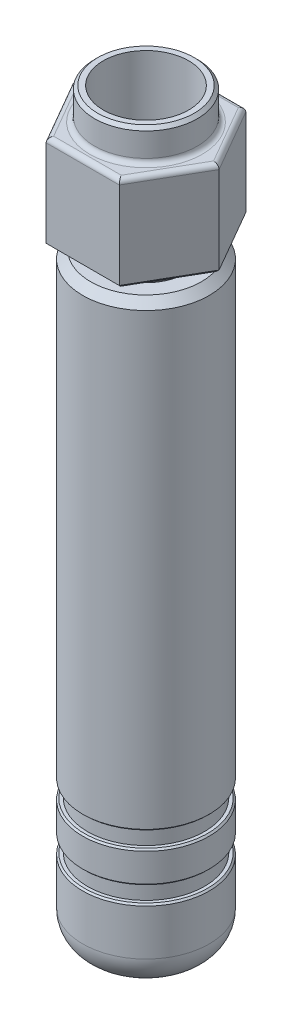
ISO-10303-21;
HEADER;
FILE_DESCRIPTION(('STEP AP214'),'2;1');
FILE_NAME('part.step','',(''),(''),'','','');
FILE_SCHEMA(('AUTOMOTIVE_DESIGN { 1 0 10303 214 1 1 1 1 }'));
ENDSEC;
DATA;
#1=APPLICATION_CONTEXT('core data for automotive mechanical design processes');
#2=APPLICATION_PROTOCOL_DEFINITION('international standard','automotive_design',2000,#1);
#3=PRODUCT_CONTEXT('',#1,'mechanical');
#4=PRODUCT('Part','Part','',(#3));
#5=PRODUCT_RELATED_PRODUCT_CATEGORY('part','',(#4));
#6=PRODUCT_DEFINITION_FORMATION('','',#4);
#7=PRODUCT_DEFINITION_CONTEXT('part definition',#1,'design');
#8=PRODUCT_DEFINITION('design','',#6,#7);
#9=PRODUCT_DEFINITION_SHAPE('','',#8);
#10=(LENGTH_UNIT() NAMED_UNIT(*) SI_UNIT(.MILLI.,.METRE.));
#11=(NAMED_UNIT(*) PLANE_ANGLE_UNIT() SI_UNIT($,.RADIAN.));
#12=(NAMED_UNIT(*) SI_UNIT($,.STERADIAN.) SOLID_ANGLE_UNIT());
#13=UNCERTAINTY_MEASURE_WITH_UNIT(LENGTH_MEASURE(1.E-05),#10,'distance_accuracy_value','');
#14=(GEOMETRIC_REPRESENTATION_CONTEXT(3) GLOBAL_UNCERTAINTY_ASSIGNED_CONTEXT((#13)) GLOBAL_UNIT_ASSIGNED_CONTEXT((#10,
#11,#12)) REPRESENTATION_CONTEXT('',''));
#15=CARTESIAN_POINT('',(0.,0.,0.));
#16=DIRECTION('',(0.,0.,1.));
#17=DIRECTION('',(1.,0.,0.));
#18=AXIS2_PLACEMENT_3D('',#15,#16,#17);
#19=CARTESIAN_POINT('',(0.,1.,0.));
#20=DIRECTION('',(0.,-1.,0.));
#21=DIRECTION('',(0.,0.,-1.));
#22=AXIS2_PLACEMENT_3D('',#19,#20,#21);
#23=CYLINDRICAL_SURFACE('',#22,2.85);
#24=CARTESIAN_POINT('',(0.,0.300000000000002,0.));
#25=DIRECTION('',(0.,1.,0.));
#26=DIRECTION('',(0.,0.,1.));
#27=AXIS2_PLACEMENT_3D('',#24,#25,#26);
#28=CIRCLE('',#27,2.85);
#29=CARTESIAN_POINT('',(0.,0.300000000000002,2.85));
#30=VERTEX_POINT('',#29);
#31=EDGE_CURVE('E255',#30,#30,#28,.T.);
#32=ORIENTED_EDGE('',*,*,#31,.T.);
#33=EDGE_LOOP('',(#32));
#34=FACE_BOUND('',#33,.T.);
#35=CARTESIAN_POINT('',(0.,0.800000000000002,0.));
#36=DIRECTION('',(0.,1.,0.));
#37=DIRECTION('',(0.,0.,1.));
#38=AXIS2_PLACEMENT_3D('',#35,#36,#37);
#39=CIRCLE('',#38,2.85);
#40=CARTESIAN_POINT('',(0.,0.800000000000002,2.85));
#41=VERTEX_POINT('',#40);
#42=EDGE_CURVE('E188',#41,#41,#39,.F.);
#43=ORIENTED_EDGE('',*,*,#42,.T.);
#44=EDGE_LOOP('',(#43));
#45=FACE_BOUND('',#44,.T.);
#46=ADVANCED_FACE('F39',(#34,#45),#23,.T.);
#47=CARTESIAN_POINT('',(2.3094010767585,7.,4.));
#48=DIRECTION('',(-0.866025403784439,0.,-0.5));
#49=DIRECTION('',(-0.5,0.,0.866025403784439));
#50=AXIS2_PLACEMENT_3D('',#47,#48,#49);
#51=PLANE('',#50);
#52=DIRECTION('',(0.,-1.,0.));
#53=VECTOR('',#52,1.);
#54=CARTESIAN_POINT('',(4.618802153517,7.,0.));
#55=LINE('',#54,#53);
#56=CARTESIAN_POINT('',(4.618802153517,6.7,0.));
#57=VERTEX_POINT('',#56);
#58=CARTESIAN_POINT('',(4.618802153517,1.2,0.));
#59=VERTEX_POINT('',#58);
#60=EDGE_CURVE('E136',#57,#59,#55,.T.);
#61=ORIENTED_EDGE('',*,*,#60,.F.);
#62=DIRECTION('',(0.5,0.,-0.866025403784439));
#63=VECTOR('',#62,1.);
#64=CARTESIAN_POINT('',(2.3094010767585,6.7,4.));
#65=LINE('',#64,#63);
#66=CARTESIAN_POINT('',(2.3094010767585,6.7,4.));
#67=VERTEX_POINT('',#66);
#68=EDGE_CURVE('E228',#57,#67,#65,.F.);
#69=ORIENTED_EDGE('',*,*,#68,.T.);
#70=DIRECTION('',(0.,-1.,0.));
#71=VECTOR('',#70,1.);
#72=CARTESIAN_POINT('',(2.3094010767585,7.,4.));
#73=LINE('',#72,#71);
#74=CARTESIAN_POINT('',(2.3094010767585,1.2,4.));
#75=VERTEX_POINT('',#74);
#76=EDGE_CURVE('E203',#67,#75,#73,.T.);
#77=ORIENTED_EDGE('',*,*,#76,.T.);
#78=DIRECTION('',(0.5,0.,-0.866025403784439));
#79=VECTOR('',#78,1.);
#80=CARTESIAN_POINT('',(2.3094010767585,1.2,4.));
#81=LINE('',#80,#79);
#82=EDGE_CURVE('E186',#75,#59,#81,.T.);
#83=ORIENTED_EDGE('',*,*,#82,.T.);
#84=EDGE_LOOP('',(#61,#69,#77,#83));
#85=FACE_BOUND('',#84,.T.);
#86=ADVANCED_FACE('F306',(#85),#51,.F.);
#87=CARTESIAN_POINT('',(4.618802153517,7.,0.));
#88=DIRECTION('',(-0.866025403784439,0.,0.5));
#89=DIRECTION('',(0.5,0.,0.866025403784439));
#90=AXIS2_PLACEMENT_3D('',#87,#88,#89);
#91=PLANE('',#90);
#92=DIRECTION('',(0.,-1.,0.));
#93=VECTOR('',#92,1.);
#94=CARTESIAN_POINT('',(2.3094010767585,7.,-4.));
#95=LINE('',#94,#93);
#96=CARTESIAN_POINT('',(2.3094010767585,6.7,-4.));
#97=VERTEX_POINT('',#96);
#98=CARTESIAN_POINT('',(2.3094010767585,1.2,-4.));
#99=VERTEX_POINT('',#98);
#100=EDGE_CURVE('E128',#97,#99,#95,.T.);
#101=ORIENTED_EDGE('',*,*,#100,.F.);
#102=DIRECTION('',(-0.5,0.,-0.866025403784439));
#103=VECTOR('',#102,1.);
#104=CARTESIAN_POINT('',(4.618802153517,6.7,0.));
#105=LINE('',#104,#103);
#106=EDGE_CURVE('E55',#97,#57,#105,.F.);
#107=ORIENTED_EDGE('',*,*,#106,.T.);
#108=ORIENTED_EDGE('',*,*,#60,.T.);
#109=DIRECTION('',(-0.5,0.,-0.866025403784439));
#110=VECTOR('',#109,1.);
#111=CARTESIAN_POINT('',(4.618802153517,1.2,0.));
#112=LINE('',#111,#110);
#113=EDGE_CURVE('E145',#59,#99,#112,.T.);
#114=ORIENTED_EDGE('',*,*,#113,.T.);
#115=EDGE_LOOP('',(#101,#107,#108,#114));
#116=FACE_BOUND('',#115,.T.);
#117=ADVANCED_FACE('F159',(#116),#91,.F.);
#118=CARTESIAN_POINT('',(2.3094010767585,7.,-4.));
#119=DIRECTION('',(0.,0.,1.));
#120=DIRECTION('',(1.,0.,0.));
#121=AXIS2_PLACEMENT_3D('',#118,#119,#120);
#122=PLANE('',#121);
#123=DIRECTION('',(0.,-1.,0.));
#124=VECTOR('',#123,1.);
#125=CARTESIAN_POINT('',(-2.3094010767585,7.,-4.));
#126=LINE('',#125,#124);
#127=CARTESIAN_POINT('',(-2.3094010767585,6.7,-4.));
#128=VERTEX_POINT('',#127);
#129=CARTESIAN_POINT('',(-2.3094010767585,1.2,-4.));
#130=VERTEX_POINT('',#129);
#131=EDGE_CURVE('E137',#128,#130,#126,.T.);
#132=ORIENTED_EDGE('',*,*,#131,.F.);
#133=DIRECTION('',(-1.,0.,0.));
#134=VECTOR('',#133,1.);
#135=CARTESIAN_POINT('',(2.3094010767585,6.7,-4.));
#136=LINE('',#135,#134);
#137=EDGE_CURVE('E63',#128,#97,#136,.F.);
#138=ORIENTED_EDGE('',*,*,#137,.T.);
#139=ORIENTED_EDGE('',*,*,#100,.T.);
#140=DIRECTION('',(-1.,0.,0.));
#141=VECTOR('',#140,1.);
#142=CARTESIAN_POINT('',(2.3094010767585,1.2,-4.));
#143=LINE('',#142,#141);
#144=EDGE_CURVE('E132',#99,#130,#143,.T.);
#145=ORIENTED_EDGE('',*,*,#144,.T.);
#146=EDGE_LOOP('',(#132,#138,#139,#145));
#147=FACE_BOUND('',#146,.T.);
#148=ADVANCED_FACE('F130',(#147),#122,.F.);
#149=CARTESIAN_POINT('',(-2.3094010767585,7.,-4.));
#150=DIRECTION('',(0.866025403784439,0.,0.5));
#151=DIRECTION('',(0.5,0.,-0.866025403784439));
#152=AXIS2_PLACEMENT_3D('',#149,#150,#151);
#153=PLANE('',#152);
#154=DIRECTION('',(0.,-1.,0.));
#155=VECTOR('',#154,1.);
#156=CARTESIAN_POINT('',(-4.61880215351701,7.,0.));
#157=LINE('',#156,#155);
#158=CARTESIAN_POINT('',(-4.61880215351701,6.7,0.));
#159=VERTEX_POINT('',#158);
#160=CARTESIAN_POINT('',(-4.61880215351701,1.2,0.));
#161=VERTEX_POINT('',#160);
#162=EDGE_CURVE('E591',#159,#161,#157,.T.);
#163=ORIENTED_EDGE('',*,*,#162,.F.);
#164=DIRECTION('',(-0.5,0.,0.866025403784439));
#165=VECTOR('',#164,1.);
#166=CARTESIAN_POINT('',(-2.3094010767585,6.7,-4.));
#167=LINE('',#166,#165);
#168=EDGE_CURVE('E224',#159,#128,#167,.F.);
#169=ORIENTED_EDGE('',*,*,#168,.T.);
#170=ORIENTED_EDGE('',*,*,#131,.T.);
#171=DIRECTION('',(-0.5,0.,0.866025403784439));
#172=VECTOR('',#171,1.);
#173=CARTESIAN_POINT('',(-2.3094010767585,1.2,-4.));
#174=LINE('',#173,#172);
#175=EDGE_CURVE('E157',#130,#161,#174,.T.);
#176=ORIENTED_EDGE('',*,*,#175,.T.);
#177=EDGE_LOOP('',(#163,#169,#170,#176));
#178=FACE_BOUND('',#177,.T.);
#179=ADVANCED_FACE('F595',(#178),#153,.F.);
#180=CARTESIAN_POINT('',(-4.61880215351701,7.,0.));
#181=DIRECTION('',(0.866025403784439,0.,-0.5));
#182=DIRECTION('',(-0.5,0.,-0.866025403784439));
#183=AXIS2_PLACEMENT_3D('',#180,#181,#182);
#184=PLANE('',#183);
#185=DIRECTION('',(0.,-1.,0.));
#186=VECTOR('',#185,1.);
#187=CARTESIAN_POINT('',(-2.3094010767585,7.,4.));
#188=LINE('',#187,#186);
#189=CARTESIAN_POINT('',(-2.3094010767585,6.7,4.));
#190=VERTEX_POINT('',#189);
#191=CARTESIAN_POINT('',(-2.3094010767585,1.2,4.));
#192=VERTEX_POINT('',#191);
#193=EDGE_CURVE('E589',#190,#192,#188,.T.);
#194=ORIENTED_EDGE('',*,*,#193,.F.);
#195=DIRECTION('',(0.5,0.,0.866025403784439));
#196=VECTOR('',#195,1.);
#197=CARTESIAN_POINT('',(-4.61880215351701,6.7,0.));
#198=LINE('',#197,#196);
#199=EDGE_CURVE('E222',#190,#159,#198,.F.);
#200=ORIENTED_EDGE('',*,*,#199,.T.);
#201=ORIENTED_EDGE('',*,*,#162,.T.);
#202=DIRECTION('',(0.5,0.,0.866025403784439));
#203=VECTOR('',#202,1.);
#204=CARTESIAN_POINT('',(-4.61880215351701,1.2,0.));
#205=LINE('',#204,#203);
#206=EDGE_CURVE('E180',#161,#192,#205,.T.);
#207=ORIENTED_EDGE('',*,*,#206,.T.);
#208=EDGE_LOOP('',(#194,#200,#201,#207));
#209=FACE_BOUND('',#208,.T.);
#210=ADVANCED_FACE('F622',(#209),#184,.F.);
#211=CARTESIAN_POINT('',(-2.3094010767585,7.,4.));
#212=DIRECTION('',(0.,0.,-1.));
#213=DIRECTION('',(-1.,0.,0.));
#214=AXIS2_PLACEMENT_3D('',#211,#212,#213);
#215=PLANE('',#214);
#216=ORIENTED_EDGE('',*,*,#76,.F.);
#217=DIRECTION('',(1.,0.,0.));
#218=VECTOR('',#217,1.);
#219=CARTESIAN_POINT('',(-2.3094010767585,6.7,4.));
#220=LINE('',#219,#218);
#221=EDGE_CURVE('E219',#67,#190,#220,.F.);
#222=ORIENTED_EDGE('',*,*,#221,.T.);
#223=ORIENTED_EDGE('',*,*,#193,.T.);
#224=DIRECTION('',(1.,0.,0.));
#225=VECTOR('',#224,1.);
#226=CARTESIAN_POINT('',(-2.3094010767585,1.2,4.));
#227=LINE('',#226,#225);
#228=EDGE_CURVE('E183',#192,#75,#227,.T.);
#229=ORIENTED_EDGE('',*,*,#228,.T.);
#230=EDGE_LOOP('',(#216,#222,#223,#229));
#231=FACE_BOUND('',#230,.T.);
#232=ADVANCED_FACE('F615',(#231),#215,.F.);
#233=CARTESIAN_POINT('',(0.,7.,0.));
#234=DIRECTION('',(0.,1.,0.));
#235=DIRECTION('',(0.,0.,1.));
#236=AXIS2_PLACEMENT_3D('',#233,#234,#235);
#237=PLANE('',#236);
#238=DIRECTION('',(0.5,0.,0.866025403784439));
#239=VECTOR('',#238,1.);
#240=CARTESIAN_POINT('',(-2.04959345562317,7.,3.85));
#241=LINE('',#240,#239);
#242=CARTESIAN_POINT('',(-4.27239199200323,7.,0.));
#243=VERTEX_POINT('',#242);
#244=CARTESIAN_POINT('',(-2.13619599600161,7.,3.7));
#245=VERTEX_POINT('',#244);
#246=EDGE_CURVE('E214',#243,#245,#241,.T.);
#247=ORIENTED_EDGE('',*,*,#246,.T.);
#248=DIRECTION('',(1.,0.,0.));
#249=VECTOR('',#248,1.);
#250=CARTESIAN_POINT('',(2.3094010767585,7.,3.7));
#251=LINE('',#250,#249);
#252=CARTESIAN_POINT('',(2.13619599600162,7.,3.7));
#253=VERTEX_POINT('',#252);
#254=EDGE_CURVE('E216',#245,#253,#251,.T.);
#255=ORIENTED_EDGE('',*,*,#254,.T.);
#256=DIRECTION('',(0.5,0.,-0.866025403784439));
#257=VECTOR('',#256,1.);
#258=CARTESIAN_POINT('',(4.35899453238167,7.,-0.150000000000001));
#259=LINE('',#258,#257);
#260=CARTESIAN_POINT('',(4.27239199200323,7.,0.));
#261=VERTEX_POINT('',#260);
#262=EDGE_CURVE('E206',#253,#261,#259,.T.);
#263=ORIENTED_EDGE('',*,*,#262,.T.);
#264=DIRECTION('',(-0.5,0.,-0.866025403784439));
#265=VECTOR('',#264,1.);
#266=CARTESIAN_POINT('',(2.04959345562317,7.,-3.85));
#267=LINE('',#266,#265);
#268=CARTESIAN_POINT('',(2.13619599600161,7.,-3.7));
#269=VERTEX_POINT('',#268);
#270=EDGE_CURVE('E208',#261,#269,#267,.T.);
#271=ORIENTED_EDGE('',*,*,#270,.T.);
#272=DIRECTION('',(-1.,0.,0.));
#273=VECTOR('',#272,1.);
#274=CARTESIAN_POINT('',(-2.3094010767585,7.,-3.7));
#275=LINE('',#274,#273);
#276=CARTESIAN_POINT('',(-2.13619599600162,7.,-3.7));
#277=VERTEX_POINT('',#276);
#278=EDGE_CURVE('E210',#269,#277,#275,.T.);
#279=ORIENTED_EDGE('',*,*,#278,.T.);
#280=DIRECTION('',(-0.5,0.,0.866025403784439));
#281=VECTOR('',#280,1.);
#282=CARTESIAN_POINT('',(-4.35899453238167,7.,0.150000000000001));
#283=LINE('',#282,#281);
#284=EDGE_CURVE('E212',#277,#243,#283,.T.);
#285=ORIENTED_EDGE('',*,*,#284,.T.);
#286=EDGE_LOOP('',(#247,#255,#263,#271,#279,#285));
#287=FACE_BOUND('',#286,.T.);
#288=CARTESIAN_POINT('',(0.,7.,0.));
#289=DIRECTION('',(0.,1.,0.));
#290=DIRECTION('',(0.,0.,1.));
#291=AXIS2_PLACEMENT_3D('',#288,#289,#290);
#292=CIRCLE('',#291,3.55);
#293=CARTESIAN_POINT('',(0.,7.,3.55));
#294=VERTEX_POINT('',#293);
#295=EDGE_CURVE('E190',#294,#294,#292,.F.);
#296=ORIENTED_EDGE('',*,*,#295,.T.);
#297=EDGE_LOOP('',(#296));
#298=FACE_BOUND('',#297,.T.);
#299=ADVANCED_FACE('F604',(#287,#298),#237,.T.);
#300=CARTESIAN_POINT('',(0.,1.,0.));
#301=DIRECTION('',(0.,1.,0.));
#302=DIRECTION('',(0.,0.,1.));
#303=AXIS2_PLACEMENT_3D('',#300,#301,#302);
#304=PLANE('',#303);
#305=DIRECTION('',(1.,0.,0.));
#306=VECTOR('',#305,1.);
#307=CARTESIAN_POINT('',(0.,1.,-3.8));
#308=LINE('',#307,#306);
#309=CARTESIAN_POINT('',(-2.19393102292058,1.,-3.8));
#310=VERTEX_POINT('',#309);
#311=CARTESIAN_POINT('',(2.19393102292058,1.,-3.8));
#312=VERTEX_POINT('',#311);
#313=EDGE_CURVE('E175',#310,#312,#308,.T.);
#314=ORIENTED_EDGE('',*,*,#313,.T.);
#315=DIRECTION('',(0.5,0.,0.866025403784439));
#316=VECTOR('',#315,1.);
#317=CARTESIAN_POINT('',(3.29089653438086,1.,-1.9));
#318=LINE('',#317,#316);
#319=CARTESIAN_POINT('',(4.38786204584115,1.,0.));
#320=VERTEX_POINT('',#319);
#321=EDGE_CURVE('E147',#312,#320,#318,.T.);
#322=ORIENTED_EDGE('',*,*,#321,.T.);
#323=DIRECTION('',(-0.5,0.,0.866025403784439));
#324=VECTOR('',#323,1.);
#325=CARTESIAN_POINT('',(3.29089653438086,1.,1.9));
#326=LINE('',#325,#324);
#327=CARTESIAN_POINT('',(2.19393102292058,1.,3.8));
#328=VERTEX_POINT('',#327);
#329=EDGE_CURVE('E164',#320,#328,#326,.T.);
#330=ORIENTED_EDGE('',*,*,#329,.T.);
#331=DIRECTION('',(-1.,0.,0.));
#332=VECTOR('',#331,1.);
#333=CARTESIAN_POINT('',(0.,1.,3.8));
#334=LINE('',#333,#332);
#335=CARTESIAN_POINT('',(-2.19393102292058,1.,3.8));
#336=VERTEX_POINT('',#335);
#337=EDGE_CURVE('E169',#328,#336,#334,.T.);
#338=ORIENTED_EDGE('',*,*,#337,.T.);
#339=DIRECTION('',(-0.5,0.,-0.866025403784439));
#340=VECTOR('',#339,1.);
#341=CARTESIAN_POINT('',(-3.29089653438086,1.,1.9));
#342=LINE('',#341,#340);
#343=CARTESIAN_POINT('',(-4.38786204584115,1.,0.));
#344=VERTEX_POINT('',#343);
#345=EDGE_CURVE('E171',#336,#344,#342,.T.);
#346=ORIENTED_EDGE('',*,*,#345,.T.);
#347=DIRECTION('',(0.5,0.,-0.866025403784439));
#348=VECTOR('',#347,1.);
#349=CARTESIAN_POINT('',(-3.29089653438087,1.,-1.9));
#350=LINE('',#349,#348);
#351=EDGE_CURVE('E173',#344,#310,#350,.T.);
#352=ORIENTED_EDGE('',*,*,#351,.T.);
#353=EDGE_LOOP('',(#314,#322,#330,#338,#346,#352));
#354=FACE_BOUND('',#353,.T.);
#355=CARTESIAN_POINT('',(0.,1.,0.));
#356=DIRECTION('',(0.,1.,0.));
#357=DIRECTION('',(0.,0.,1.));
#358=AXIS2_PLACEMENT_3D('',#355,#356,#357);
#359=CIRCLE('',#358,3.05);
#360=CARTESIAN_POINT('',(0.,1.,3.05));
#361=VERTEX_POINT('',#360);
#362=EDGE_CURVE('E161',#361,#361,#359,.T.);
#363=ORIENTED_EDGE('',*,*,#362,.T.);
#364=EDGE_LOOP('',(#363));
#365=FACE_BOUND('',#364,.T.);
#366=ADVANCED_FACE('F631',(#354,#365),#304,.F.);
#367=CARTESIAN_POINT('',(0.,9.,0.));
#368=DIRECTION('',(0.,-1.,0.));
#369=DIRECTION('',(0.,0.,-1.));
#370=AXIS2_PLACEMENT_3D('',#367,#368,#369);
#371=CYLINDRICAL_SURFACE('',#370,3.25);
#372=CARTESIAN_POINT('',(0.,8.8,0.));
#373=DIRECTION('',(0.,1.,0.));
#374=DIRECTION('',(0.,0.,1.));
#375=AXIS2_PLACEMENT_3D('',#372,#373,#374);
#376=CIRCLE('',#375,3.25);
#377=CARTESIAN_POINT('',(0.,8.8,3.25));
#378=VERTEX_POINT('',#377);
#379=EDGE_CURVE('E252',#378,#378,#376,.F.);
#380=ORIENTED_EDGE('',*,*,#379,.T.);
#381=EDGE_LOOP('',(#380));
#382=FACE_BOUND('',#381,.T.);
#383=CARTESIAN_POINT('',(0.,7.3,0.));
#384=DIRECTION('',(0.,1.,0.));
#385=DIRECTION('',(0.,0.,1.));
#386=AXIS2_PLACEMENT_3D('',#383,#384,#385);
#387=CIRCLE('',#386,3.25);
#388=CARTESIAN_POINT('',(0.,7.3,3.25));
#389=VERTEX_POINT('',#388);
#390=EDGE_CURVE('E230',#389,#389,#387,.T.);
#391=ORIENTED_EDGE('',*,*,#390,.T.);
#392=EDGE_LOOP('',(#391));
#393=FACE_BOUND('',#392,.T.);
#394=ADVANCED_FACE('F635',(#382,#393),#371,.T.);
#395=CARTESIAN_POINT('',(0.,9.,0.));
#396=DIRECTION('',(0.,1.,0.));
#397=DIRECTION('',(0.,0.,1.));
#398=AXIS2_PLACEMENT_3D('',#395,#396,#397);
#399=PLANE('',#398);
#400=CARTESIAN_POINT('',(0.,9.,0.));
#401=DIRECTION('',(0.,1.,0.));
#402=DIRECTION('',(0.,0.,1.));
#403=AXIS2_PLACEMENT_3D('',#400,#401,#402);
#404=CIRCLE('',#403,2.7);
#405=CARTESIAN_POINT('',(0.,9.,2.7));
#406=VERTEX_POINT('',#405);
#407=EDGE_CURVE('E576',#406,#406,#404,.T.);
#408=ORIENTED_EDGE('',*,*,#407,.F.);
#409=EDGE_LOOP('',(#408));
#410=FACE_BOUND('',#409,.T.);
#411=CARTESIAN_POINT('',(0.,9.,0.));
#412=DIRECTION('',(0.,1.,0.));
#413=DIRECTION('',(0.,0.,1.));
#414=AXIS2_PLACEMENT_3D('',#411,#412,#413);
#415=CIRCLE('',#414,3.05);
#416=CARTESIAN_POINT('',(0.,9.,3.05));
#417=VERTEX_POINT('',#416);
#418=EDGE_CURVE('E233',#417,#417,#415,.T.);
#419=ORIENTED_EDGE('',*,*,#418,.T.);
#420=EDGE_LOOP('',(#419));
#421=FACE_BOUND('',#420,.T.);
#422=ADVANCED_FACE('F356',(#410,#421),#399,.T.);
#423=CARTESIAN_POINT('',(-4.61880215351701,1.2,0.));
#424=DIRECTION('',(0.612372435695794,0.707106781186549,-0.353553390593273));
#425=DIRECTION('',(0.5,0.,0.866025403784439));
#426=AXIS2_PLACEMENT_3D('',#423,#424,#425);
#427=PLANE('',#426);
#428=DIRECTION('',(0.755928946018455,-0.654653670707977,0.));
#429=VECTOR('',#428,1.);
#430=CARTESIAN_POINT('',(-4.61880215351701,1.2,0.));
#431=LINE('',#430,#429);
#432=EDGE_CURVE('E197',#344,#161,#431,.F.);
#433=ORIENTED_EDGE('',*,*,#432,.F.);
#434=ORIENTED_EDGE('',*,*,#345,.F.);
#435=DIRECTION('',(0.377964473009229,-0.654653670707977,-0.654653670707977));
#436=VECTOR('',#435,1.);
#437=CARTESIAN_POINT('',(-2.3094010767585,1.2,4.));
#438=LINE('',#437,#436);
#439=EDGE_CURVE('E200',#192,#336,#438,.T.);
#440=ORIENTED_EDGE('',*,*,#439,.F.);
#441=ORIENTED_EDGE('',*,*,#206,.F.);
#442=EDGE_LOOP('',(#433,#434,#440,#441));
#443=FACE_BOUND('',#442,.T.);
#444=ADVANCED_FACE('F350',(#443),#427,.F.);
#445=CARTESIAN_POINT('',(-2.3094010767585,1.2,4.));
#446=DIRECTION('',(0.,0.707106781186547,-0.707106781186547));
#447=DIRECTION('',(1.,0.,0.));
#448=AXIS2_PLACEMENT_3D('',#445,#446,#447);
#449=PLANE('',#448);
#450=ORIENTED_EDGE('',*,*,#439,.T.);
#451=ORIENTED_EDGE('',*,*,#337,.F.);
#452=DIRECTION('',(-0.37796447300923,-0.654653670707977,-0.654653670707977));
#453=VECTOR('',#452,1.);
#454=CARTESIAN_POINT('',(2.3094010767585,1.2,4.));
#455=LINE('',#454,#453);
#456=EDGE_CURVE('E194',#75,#328,#455,.T.);
#457=ORIENTED_EDGE('',*,*,#456,.F.);
#458=ORIENTED_EDGE('',*,*,#228,.F.);
#459=EDGE_LOOP('',(#450,#451,#457,#458));
#460=FACE_BOUND('',#459,.T.);
#461=ADVANCED_FACE('F343',(#460),#449,.F.);
#462=CARTESIAN_POINT('',(-2.3094010767585,1.2,-4.));
#463=DIRECTION('',(0.612372435695795,0.707106781186548,0.353553390593274));
#464=DIRECTION('',(-0.5,0.,0.866025403784439));
#465=AXIS2_PLACEMENT_3D('',#462,#463,#464);
#466=PLANE('',#465);
#467=ORIENTED_EDGE('',*,*,#432,.T.);
#468=ORIENTED_EDGE('',*,*,#175,.F.);
#469=DIRECTION('',(0.377964473009228,-0.654653670707977,0.654653670707977));
#470=VECTOR('',#469,1.);
#471=CARTESIAN_POINT('',(-2.3094010767585,1.2,-4.));
#472=LINE('',#471,#470);
#473=EDGE_CURVE('E156',#310,#130,#472,.F.);
#474=ORIENTED_EDGE('',*,*,#473,.F.);
#475=ORIENTED_EDGE('',*,*,#351,.F.);
#476=EDGE_LOOP('',(#467,#468,#474,#475));
#477=FACE_BOUND('',#476,.T.);
#478=ADVANCED_FACE('F336',(#477),#466,.F.);
#479=CARTESIAN_POINT('',(2.3094010767585,1.2,4.));
#480=DIRECTION('',(-0.612372435695794,0.707106781186549,-0.353553390593273));
#481=DIRECTION('',(0.5,0.,-0.866025403784439));
#482=AXIS2_PLACEMENT_3D('',#479,#480,#481);
#483=PLANE('',#482);
#484=ORIENTED_EDGE('',*,*,#456,.T.);
#485=ORIENTED_EDGE('',*,*,#329,.F.);
#486=DIRECTION('',(0.755928946018455,0.654653670707976,0.));
#487=VECTOR('',#486,1.);
#488=CARTESIAN_POINT('',(3.29914439536929,0.0571428571428654,0.));
#489=LINE('',#488,#487);
#490=EDGE_CURVE('E150',#59,#320,#489,.F.);
#491=ORIENTED_EDGE('',*,*,#490,.F.);
#492=ORIENTED_EDGE('',*,*,#82,.F.);
#493=EDGE_LOOP('',(#484,#485,#491,#492));
#494=FACE_BOUND('',#493,.T.);
#495=ADVANCED_FACE('F330',(#494),#483,.F.);
#496=CARTESIAN_POINT('',(2.3094010767585,1.2,-4.));
#497=DIRECTION('',(0.,0.707106781186547,0.707106781186547));
#498=DIRECTION('',(-1.,0.,0.));
#499=AXIS2_PLACEMENT_3D('',#496,#497,#498);
#500=PLANE('',#499);
#501=ORIENTED_EDGE('',*,*,#473,.T.);
#502=ORIENTED_EDGE('',*,*,#144,.F.);
#503=DIRECTION('',(-0.377964473009228,-0.654653670707977,0.654653670707977));
#504=VECTOR('',#503,1.);
#505=CARTESIAN_POINT('',(2.3094010767585,1.2,-4.));
#506=LINE('',#505,#504);
#507=EDGE_CURVE('E143',#312,#99,#506,.F.);
#508=ORIENTED_EDGE('',*,*,#507,.F.);
#509=ORIENTED_EDGE('',*,*,#313,.F.);
#510=EDGE_LOOP('',(#501,#502,#508,#509));
#511=FACE_BOUND('',#510,.T.);
#512=ADVANCED_FACE('F154',(#511),#500,.F.);
#513=CARTESIAN_POINT('',(4.618802153517,1.2,0.));
#514=DIRECTION('',(-0.612372435695794,0.707106781186548,0.353553390593274));
#515=DIRECTION('',(-0.5,0.,-0.866025403784439));
#516=AXIS2_PLACEMENT_3D('',#513,#514,#515);
#517=PLANE('',#516);
#518=ORIENTED_EDGE('',*,*,#490,.T.);
#519=ORIENTED_EDGE('',*,*,#321,.F.);
#520=ORIENTED_EDGE('',*,*,#507,.T.);
#521=ORIENTED_EDGE('',*,*,#113,.F.);
#522=EDGE_LOOP('',(#518,#519,#520,#521));
#523=FACE_BOUND('',#522,.T.);
#524=ADVANCED_FACE('F144',(#523),#517,.F.);
#525=CARTESIAN_POINT('',(0.,1.,0.));
#526=DIRECTION('',(0.,1.,0.));
#527=DIRECTION('',(0.,0.,1.));
#528=AXIS2_PLACEMENT_3D('',#525,#526,#527);
#529=CONICAL_SURFACE('',#528,3.05,0.785398163397451);
#530=ORIENTED_EDGE('',*,*,#42,.F.);
#531=EDGE_LOOP('',(#530));
#532=FACE_BOUND('',#531,.T.);
#533=ORIENTED_EDGE('',*,*,#362,.F.);
#534=EDGE_LOOP('',(#533));
#535=FACE_BOUND('',#534,.T.);
#536=ADVANCED_FACE('F324',(#532,#535),#529,.T.);
#537=CARTESIAN_POINT('',(0.,6.7,-3.7));
#538=DIRECTION('',(1.,0.,0.));
#539=DIRECTION('',(0.,0.,-1.));
#540=AXIS2_PLACEMENT_3D('',#537,#538,#539);
#541=CYLINDRICAL_SURFACE('',#540,0.3);
#542=CARTESIAN_POINT('',(2.13619599600161,6.7,-3.7));
#543=DIRECTION('',(0.866025403784439,0.,0.5));
#544=DIRECTION('',(-0.5,0.,0.866025403784439));
#545=AXIS2_PLACEMENT_3D('',#542,#543,#544);
#546=ELLIPSE('',#545,0.346410161513775,0.3);
#547=EDGE_CURVE('E245',#97,#269,#546,.T.);
#548=ORIENTED_EDGE('',*,*,#547,.F.);
#549=ORIENTED_EDGE('',*,*,#137,.F.);
#550=CARTESIAN_POINT('',(-2.13619599600161,6.7,-3.7));
#551=DIRECTION('',(0.866025403784439,0.,-0.5));
#552=DIRECTION('',(0.5,0.,0.866025403784439));
#553=AXIS2_PLACEMENT_3D('',#550,#551,#552);
#554=ELLIPSE('',#553,0.346410161513775,0.3);
#555=EDGE_CURVE('E151',#277,#128,#554,.F.);
#556=ORIENTED_EDGE('',*,*,#555,.F.);
#557=ORIENTED_EDGE('',*,*,#278,.F.);
#558=EDGE_LOOP('',(#548,#549,#556,#557));
#559=FACE_BOUND('',#558,.T.);
#560=ADVANCED_FACE('F363',(#559),#541,.T.);
#561=CARTESIAN_POINT('',(-3.20429399400242,6.7,-1.85));
#562=DIRECTION('',(0.5,0.,-0.866025403784439));
#563=DIRECTION('',(-0.866025403784439,0.,-0.5));
#564=AXIS2_PLACEMENT_3D('',#561,#562,#563);
#565=CYLINDRICAL_SURFACE('',#564,0.3);
#566=ORIENTED_EDGE('',*,*,#555,.T.);
#567=ORIENTED_EDGE('',*,*,#168,.F.);
#568=CARTESIAN_POINT('',(-4.27239199200323,6.7,0.));
#569=DIRECTION('',(0.,0.,-1.));
#570=DIRECTION('',(1.,0.,0.));
#571=AXIS2_PLACEMENT_3D('',#568,#569,#570);
#572=ELLIPSE('',#571,0.346410161513775,0.3);
#573=EDGE_CURVE('E242',#243,#159,#572,.F.);
#574=ORIENTED_EDGE('',*,*,#573,.F.);
#575=ORIENTED_EDGE('',*,*,#284,.F.);
#576=EDGE_LOOP('',(#566,#567,#574,#575));
#577=FACE_BOUND('',#576,.T.);
#578=ADVANCED_FACE('F381',(#577),#565,.T.);
#579=CARTESIAN_POINT('',(3.20429399400242,6.7,-1.85));
#580=DIRECTION('',(0.5,0.,0.866025403784439));
#581=DIRECTION('',(0.866025403784439,0.,-0.5));
#582=AXIS2_PLACEMENT_3D('',#579,#580,#581);
#583=CYLINDRICAL_SURFACE('',#582,0.3);
#584=ORIENTED_EDGE('',*,*,#547,.T.);
#585=ORIENTED_EDGE('',*,*,#270,.F.);
#586=CARTESIAN_POINT('',(4.27239199200323,6.7,0.));
#587=DIRECTION('',(0.,0.,1.));
#588=DIRECTION('',(-1.,0.,0.));
#589=AXIS2_PLACEMENT_3D('',#586,#587,#588);
#590=ELLIPSE('',#589,0.346410161513775,0.3);
#591=EDGE_CURVE('E239',#57,#261,#590,.T.);
#592=ORIENTED_EDGE('',*,*,#591,.F.);
#593=ORIENTED_EDGE('',*,*,#106,.F.);
#594=EDGE_LOOP('',(#584,#585,#592,#593));
#595=FACE_BOUND('',#594,.T.);
#596=ADVANCED_FACE('F377',(#595),#583,.T.);
#597=CARTESIAN_POINT('',(-3.20429399400242,6.7,1.85));
#598=DIRECTION('',(-0.5,0.,-0.866025403784439));
#599=DIRECTION('',(-0.866025403784439,0.,0.5));
#600=AXIS2_PLACEMENT_3D('',#597,#598,#599);
#601=CYLINDRICAL_SURFACE('',#600,0.3);
#602=ORIENTED_EDGE('',*,*,#573,.T.);
#603=ORIENTED_EDGE('',*,*,#199,.F.);
#604=CARTESIAN_POINT('',(-2.13619599600161,6.7,3.7));
#605=DIRECTION('',(-0.866025403784439,0.,-0.5));
#606=DIRECTION('',(0.5,0.,-0.866025403784439));
#607=AXIS2_PLACEMENT_3D('',#604,#605,#606);
#608=ELLIPSE('',#607,0.346410161513775,0.3);
#609=EDGE_CURVE('E236',#245,#190,#608,.F.);
#610=ORIENTED_EDGE('',*,*,#609,.F.);
#611=ORIENTED_EDGE('',*,*,#246,.F.);
#612=EDGE_LOOP('',(#602,#603,#610,#611));
#613=FACE_BOUND('',#612,.T.);
#614=ADVANCED_FACE('F373',(#613),#601,.T.);
#615=CARTESIAN_POINT('',(3.20429399400242,6.7,1.85));
#616=DIRECTION('',(-0.5,0.,0.866025403784439));
#617=DIRECTION('',(0.866025403784439,0.,0.5));
#618=AXIS2_PLACEMENT_3D('',#615,#616,#617);
#619=CYLINDRICAL_SURFACE('',#618,0.3);
#620=ORIENTED_EDGE('',*,*,#591,.T.);
#621=ORIENTED_EDGE('',*,*,#262,.F.);
#622=CARTESIAN_POINT('',(2.13619599600161,6.7,3.7));
#623=DIRECTION('',(-0.866025403784438,0.,0.5));
#624=DIRECTION('',(0.5,0.,0.866025403784438));
#625=AXIS2_PLACEMENT_3D('',#622,#623,#624);
#626=ELLIPSE('',#625,0.346410161513776,0.3);
#627=EDGE_CURVE('E234',#67,#253,#626,.T.);
#628=ORIENTED_EDGE('',*,*,#627,.F.);
#629=ORIENTED_EDGE('',*,*,#68,.F.);
#630=EDGE_LOOP('',(#620,#621,#628,#629));
#631=FACE_BOUND('',#630,.T.);
#632=ADVANCED_FACE('F369',(#631),#619,.T.);
#633=CARTESIAN_POINT('',(0.,6.7,3.7));
#634=DIRECTION('',(-1.,0.,0.));
#635=DIRECTION('',(0.,0.,1.));
#636=AXIS2_PLACEMENT_3D('',#633,#634,#635);
#637=CYLINDRICAL_SURFACE('',#636,0.3);
#638=ORIENTED_EDGE('',*,*,#609,.T.);
#639=ORIENTED_EDGE('',*,*,#221,.F.);
#640=ORIENTED_EDGE('',*,*,#627,.T.);
#641=ORIENTED_EDGE('',*,*,#254,.F.);
#642=EDGE_LOOP('',(#638,#639,#640,#641));
#643=FACE_BOUND('',#642,.T.);
#644=ADVANCED_FACE('F365',(#643),#637,.T.);
#645=CARTESIAN_POINT('',(0.,7.3,0.));
#646=DIRECTION('',(0.,1.,0.));
#647=DIRECTION('',(0.,0.,1.));
#648=AXIS2_PLACEMENT_3D('',#645,#646,#647);
#649=TOROIDAL_SURFACE('',#648,3.55,0.3);
#650=ORIENTED_EDGE('',*,*,#295,.F.);
#651=EDGE_LOOP('',(#650));
#652=FACE_BOUND('',#651,.T.);
#653=ORIENTED_EDGE('',*,*,#390,.F.);
#654=EDGE_LOOP('',(#653));
#655=FACE_BOUND('',#654,.T.);
#656=ADVANCED_FACE('F368',(#652,#655),#649,.F.);
#657=CARTESIAN_POINT('',(0.,9.,0.));
#658=DIRECTION('',(0.,-1.,0.));
#659=DIRECTION('',(0.,0.,-1.));
#660=AXIS2_PLACEMENT_3D('',#657,#658,#659);
#661=CONICAL_SURFACE('',#660,3.05,0.785398163397446);
#662=ORIENTED_EDGE('',*,*,#379,.F.);
#663=EDGE_LOOP('',(#662));
#664=FACE_BOUND('',#663,.T.);
#665=ORIENTED_EDGE('',*,*,#418,.F.);
#666=EDGE_LOOP('',(#665));
#667=FACE_BOUND('',#666,.T.);
#668=ADVANCED_FACE('F391',(#664,#667),#661,.T.);
#669=CARTESIAN_POINT('',(0.,0.300000000000002,0.));
#670=DIRECTION('',(0.,1.,0.));
#671=DIRECTION('',(0.,0.,1.));
#672=AXIS2_PLACEMENT_3D('',#669,#670,#671);
#673=CONICAL_SURFACE('',#672,2.85,0.78539816339745);
#674=CARTESIAN_POINT('',(0.,0.,0.));
#675=DIRECTION('',(0.,1.,0.));
#676=DIRECTION('',(0.,0.,1.));
#677=AXIS2_PLACEMENT_3D('',#674,#675,#676);
#678=CIRCLE('',#677,2.55);
#679=CARTESIAN_POINT('',(0.,0.,2.55));
#680=VERTEX_POINT('',#679);
#681=EDGE_CURVE('E258',#680,#680,#678,.F.);
#682=ORIENTED_EDGE('',*,*,#681,.F.);
#683=EDGE_LOOP('',(#682));
#684=FACE_BOUND('',#683,.T.);
#685=ORIENTED_EDGE('',*,*,#31,.F.);
#686=EDGE_LOOP('',(#685));
#687=FACE_BOUND('',#686,.T.);
#688=ADVANCED_FACE('F398',(#684,#687),#673,.T.);
#689=CARTESIAN_POINT('',(0.,4.,0.));
#690=DIRECTION('',(0.,1.,0.));
#691=DIRECTION('',(0.,0.,1.));
#692=AXIS2_PLACEMENT_3D('',#689,#690,#691);
#693=CYLINDRICAL_SURFACE('',#692,2.7);
#694=CARTESIAN_POINT('',(0.,4.,0.));
#695=DIRECTION('',(0.,1.,0.));
#696=DIRECTION('',(0.,0.,1.));
#697=AXIS2_PLACEMENT_3D('',#694,#695,#696);
#698=CIRCLE('',#697,2.7);
#699=CARTESIAN_POINT('',(0.,4.,2.7));
#700=VERTEX_POINT('',#699);
#701=EDGE_CURVE('E237',#700,#700,#698,.T.);
#702=ORIENTED_EDGE('',*,*,#701,.F.);
#703=EDGE_LOOP('',(#702));
#704=FACE_BOUND('',#703,.T.);
#705=ORIENTED_EDGE('',*,*,#407,.T.);
#706=EDGE_LOOP('',(#705));
#707=FACE_BOUND('',#706,.T.);
#708=ADVANCED_FACE('F405',(#704,#707),#693,.F.);
#709=CARTESIAN_POINT('',(0.,4.,0.));
#710=DIRECTION('',(0.,1.,0.));
#711=DIRECTION('',(0.,0.,1.));
#712=AXIS2_PLACEMENT_3D('',#709,#710,#711);
#713=PLANE('',#712);
#714=ORIENTED_EDGE('',*,*,#701,.T.);
#715=EDGE_LOOP('',(#714));
#716=FACE_BOUND('',#715,.T.);
#717=ADVANCED_FACE('F465',(#716),#713,.T.);
#718=CARTESIAN_POINT('',(0.,-38.,0.));
#719=DIRECTION('',(0.,1.,0.));
#720=DIRECTION('',(0.,0.,1.));
#721=AXIS2_PLACEMENT_3D('',#718,#719,#720);
#722=CYLINDRICAL_SURFACE('',#721,4.);
#723=CARTESIAN_POINT('',(0.,-28.9,0.));
#724=DIRECTION('',(0.,1.,0.));
#725=DIRECTION('',(0.,0.,1.));
#726=AXIS2_PLACEMENT_3D('',#723,#724,#725);
#727=CIRCLE('',#726,4.);
#728=CARTESIAN_POINT('',(0.,-28.9,4.));
#729=VERTEX_POINT('',#728);
#730=EDGE_CURVE('E48',#729,#729,#727,.T.);
#731=ORIENTED_EDGE('',*,*,#730,.T.);
#732=EDGE_LOOP('',(#731));
#733=FACE_BOUND('',#732,.T.);
#734=CARTESIAN_POINT('',(0.,-0.500000000000007,0.));
#735=DIRECTION('',(0.,-1.,0.));
#736=DIRECTION('',(0.,0.,-1.));
#737=AXIS2_PLACEMENT_3D('',#734,#735,#736);
#738=CIRCLE('',#737,4.);
#739=CARTESIAN_POINT('',(0.,-0.500000000000007,-4.));
#740=VERTEX_POINT('',#739);
#741=EDGE_CURVE('E267',#740,#740,#738,.T.);
#742=ORIENTED_EDGE('',*,*,#741,.T.);
#743=EDGE_LOOP('',(#742));
#744=FACE_BOUND('',#743,.T.);
#745=ADVANCED_FACE('F293',(#733,#744),#722,.T.);
#746=CARTESIAN_POINT('',(0.,0.,0.));
#747=DIRECTION('',(0.,-1.,0.));
#748=DIRECTION('',(0.,0.,-1.));
#749=AXIS2_PLACEMENT_3D('',#746,#747,#748);
#750=PLANE('',#749);
#751=CARTESIAN_POINT('',(0.,0.,0.));
#752=DIRECTION('',(0.,-1.,0.));
#753=DIRECTION('',(0.,0.,-1.));
#754=AXIS2_PLACEMENT_3D('',#751,#752,#753);
#755=CIRCLE('',#754,3.49999999999999);
#756=CARTESIAN_POINT('',(0.,0.,-3.49999999999999));
#757=VERTEX_POINT('',#756);
#758=EDGE_CURVE('E270',#757,#757,#755,.F.);
#759=ORIENTED_EDGE('',*,*,#758,.T.);
#760=EDGE_LOOP('',(#759));
#761=FACE_BOUND('',#760,.T.);
#762=ORIENTED_EDGE('',*,*,#681,.T.);
#763=EDGE_LOOP('',(#762));
#764=FACE_BOUND('',#763,.T.);
#765=ADVANCED_FACE('F420',(#761,#764),#750,.F.);
#766=CARTESIAN_POINT('',(0.,-0.500000000000007,0.));
#767=DIRECTION('',(0.,-1.,0.));
#768=DIRECTION('',(0.,0.,-1.));
#769=AXIS2_PLACEMENT_3D('',#766,#767,#768);
#770=CONICAL_SURFACE('',#769,4.,0.785398163397448);
#771=ORIENTED_EDGE('',*,*,#758,.F.);
#772=EDGE_LOOP('',(#771));
#773=FACE_BOUND('',#772,.T.);
#774=ORIENTED_EDGE('',*,*,#741,.F.);
#775=EDGE_LOOP('',(#774));
#776=FACE_BOUND('',#775,.T.);
#777=ADVANCED_FACE('F413',(#773,#776),#770,.T.);
#778=CARTESIAN_POINT('',(0.,-30.,7.7));
#779=DIRECTION('',(0.,-1.,0.));
#780=DIRECTION('',(0.,0.,-1.));
#781=AXIS2_PLACEMENT_3D('',#778,#779,#780);
#782=PLANE('',#781);
#783=CARTESIAN_POINT('',(0.,-30.,0.));
#784=DIRECTION('',(0.,-1.,0.));
#785=DIRECTION('',(0.,0.,-1.));
#786=AXIS2_PLACEMENT_3D('',#783,#784,#785);
#787=CIRCLE('',#786,3.9);
#788=CARTESIAN_POINT('',(0.,-30.,-3.9));
#789=VERTEX_POINT('',#788);
#790=EDGE_CURVE('E288',#789,#789,#787,.F.);
#791=ORIENTED_EDGE('',*,*,#790,.T.);
#792=EDGE_LOOP('',(#791));
#793=FACE_BOUND('',#792,.T.);
#794=CARTESIAN_POINT('',(0.,-30.,0.));
#795=DIRECTION('',(0.,1.,0.));
#796=DIRECTION('',(0.,0.,1.));
#797=AXIS2_PLACEMENT_3D('',#794,#795,#796);
#798=CIRCLE('',#797,3.7);
#799=CARTESIAN_POINT('',(0.,-30.,3.7));
#800=VERTEX_POINT('',#799);
#801=EDGE_CURVE('E573',#800,#800,#798,.T.);
#802=ORIENTED_EDGE('',*,*,#801,.F.);
#803=EDGE_LOOP('',(#802));
#804=FACE_BOUND('',#803,.T.);
#805=ADVANCED_FACE('F419',(#793,#804),#782,.F.);
#806=CARTESIAN_POINT('',(0.,-29.,7.7));
#807=DIRECTION('',(0.,1.,0.));
#808=DIRECTION('',(0.,0.,1.));
#809=AXIS2_PLACEMENT_3D('',#806,#807,#808);
#810=PLANE('',#809);
#811=CARTESIAN_POINT('',(0.,-29.,0.));
#812=DIRECTION('',(0.,1.,0.));
#813=DIRECTION('',(0.,0.,1.));
#814=AXIS2_PLACEMENT_3D('',#811,#812,#813);
#815=CIRCLE('',#814,3.9);
#816=CARTESIAN_POINT('',(0.,-29.,3.9));
#817=VERTEX_POINT('',#816);
#818=EDGE_CURVE('E11',#817,#817,#815,.F.);
#819=ORIENTED_EDGE('',*,*,#818,.T.);
#820=EDGE_LOOP('',(#819));
#821=FACE_BOUND('',#820,.T.);
#822=CARTESIAN_POINT('',(0.,-29.,0.));
#823=DIRECTION('',(0.,1.,0.));
#824=DIRECTION('',(0.,0.,1.));
#825=AXIS2_PLACEMENT_3D('',#822,#823,#824);
#826=CIRCLE('',#825,3.7);
#827=CARTESIAN_POINT('',(0.,-29.,3.7));
#828=VERTEX_POINT('',#827);
#829=EDGE_CURVE('E579',#828,#828,#826,.T.);
#830=ORIENTED_EDGE('',*,*,#829,.T.);
#831=EDGE_LOOP('',(#830));
#832=FACE_BOUND('',#831,.T.);
#833=ADVANCED_FACE('F459',(#821,#832),#810,.F.);
#834=CARTESIAN_POINT('',(0.,0.,0.));
#835=DIRECTION('',(0.,1.,0.));
#836=DIRECTION('',(0.,0.,1.));
#837=AXIS2_PLACEMENT_3D('',#834,#835,#836);
#838=CYLINDRICAL_SURFACE('',#837,3.7);
#839=ORIENTED_EDGE('',*,*,#829,.F.);
#840=EDGE_LOOP('',(#839));
#841=FACE_BOUND('',#840,.T.);
#842=ORIENTED_EDGE('',*,*,#801,.T.);
#843=EDGE_LOOP('',(#842));
#844=FACE_BOUND('',#843,.T.);
#845=ADVANCED_FACE('F448',(#841,#844),#838,.T.);
#846=CARTESIAN_POINT('',(0.,-31.9,0.));
#847=DIRECTION('',(0.,1.,0.));
#848=DIRECTION('',(0.,0.,1.));
#849=AXIS2_PLACEMENT_3D('',#846,#847,#848);
#850=CIRCLE('',#849,4.);
#851=CARTESIAN_POINT('',(0.,-31.9,4.));
#852=VERTEX_POINT('',#851);
#853=EDGE_CURVE('E282',#852,#852,#850,.T.);
#854=ORIENTED_EDGE('',*,*,#853,.T.);
#855=EDGE_LOOP('',(#854));
#856=FACE_BOUND('',#855,.T.);
#857=CARTESIAN_POINT('',(0.,-30.1,0.));
#858=DIRECTION('',(0.,-1.,0.));
#859=DIRECTION('',(0.,0.,-1.));
#860=AXIS2_PLACEMENT_3D('',#857,#858,#859);
#861=CIRCLE('',#860,4.);
#862=CARTESIAN_POINT('',(0.,-30.1,-4.));
#863=VERTEX_POINT('',#862);
#864=EDGE_CURVE('E279',#863,#863,#861,.T.);
#865=ORIENTED_EDGE('',*,*,#864,.T.);
#866=EDGE_LOOP('',(#865));
#867=FACE_BOUND('',#866,.T.);
#868=ADVANCED_FACE('F444',(#856,#867),#722,.T.);
#869=CARTESIAN_POINT('',(0.,-33.,7.7));
#870=DIRECTION('',(0.,-1.,0.));
#871=DIRECTION('',(0.,0.,-1.));
#872=AXIS2_PLACEMENT_3D('',#869,#870,#871);
#873=PLANE('',#872);
#874=CARTESIAN_POINT('',(0.,-33.,0.));
#875=DIRECTION('',(0.,-1.,0.));
#876=DIRECTION('',(0.,0.,-1.));
#877=AXIS2_PLACEMENT_3D('',#874,#875,#876);
#878=CIRCLE('',#877,3.89999999999999);
#879=CARTESIAN_POINT('',(0.,-33.,-3.89999999999999));
#880=VERTEX_POINT('',#879);
#881=EDGE_CURVE('E276',#880,#880,#878,.F.);
#882=ORIENTED_EDGE('',*,*,#881,.T.);
#883=EDGE_LOOP('',(#882));
#884=FACE_BOUND('',#883,.T.);
#885=CARTESIAN_POINT('',(0.,-33.,0.));
#886=DIRECTION('',(0.,1.,0.));
#887=DIRECTION('',(0.,0.,1.));
#888=AXIS2_PLACEMENT_3D('',#885,#886,#887);
#889=CIRCLE('',#888,3.7);
#890=CARTESIAN_POINT('',(0.,-33.,3.7));
#891=VERTEX_POINT('',#890);
#892=EDGE_CURVE('E572',#891,#891,#889,.T.);
#893=ORIENTED_EDGE('',*,*,#892,.F.);
#894=EDGE_LOOP('',(#893));
#895=FACE_BOUND('',#894,.T.);
#896=ADVANCED_FACE('F447',(#884,#895),#873,.F.);
#897=CARTESIAN_POINT('',(0.,-32.,7.7));
#898=DIRECTION('',(0.,1.,0.));
#899=DIRECTION('',(0.,0.,1.));
#900=AXIS2_PLACEMENT_3D('',#897,#898,#899);
#901=PLANE('',#900);
#902=CARTESIAN_POINT('',(0.,-32.,0.));
#903=DIRECTION('',(0.,1.,0.));
#904=DIRECTION('',(0.,0.,1.));
#905=AXIS2_PLACEMENT_3D('',#902,#903,#904);
#906=CIRCLE('',#905,3.89999999999999);
#907=CARTESIAN_POINT('',(0.,-32.,3.89999999999999));
#908=VERTEX_POINT('',#907);
#909=EDGE_CURVE('E285',#908,#908,#906,.F.);
#910=ORIENTED_EDGE('',*,*,#909,.T.);
#911=EDGE_LOOP('',(#910));
#912=FACE_BOUND('',#911,.T.);
#913=CARTESIAN_POINT('',(0.,-32.,0.));
#914=DIRECTION('',(0.,1.,0.));
#915=DIRECTION('',(0.,0.,1.));
#916=AXIS2_PLACEMENT_3D('',#913,#914,#915);
#917=CIRCLE('',#916,3.7);
#918=CARTESIAN_POINT('',(0.,-32.,3.7));
#919=VERTEX_POINT('',#918);
#920=EDGE_CURVE('E571',#919,#919,#917,.T.);
#921=ORIENTED_EDGE('',*,*,#920,.T.);
#922=EDGE_LOOP('',(#921));
#923=FACE_BOUND('',#922,.T.);
#924=ADVANCED_FACE('F456',(#912,#923),#901,.F.);
#925=CARTESIAN_POINT('',(0.,0.,0.));
#926=DIRECTION('',(0.,1.,0.));
#927=DIRECTION('',(0.,0.,1.));
#928=AXIS2_PLACEMENT_3D('',#925,#926,#927);
#929=CYLINDRICAL_SURFACE('',#928,3.7);
#930=ORIENTED_EDGE('',*,*,#920,.F.);
#931=EDGE_LOOP('',(#930));
#932=FACE_BOUND('',#931,.T.);
#933=ORIENTED_EDGE('',*,*,#892,.T.);
#934=EDGE_LOOP('',(#933));
#935=FACE_BOUND('',#934,.T.);
#936=ADVANCED_FACE('F477',(#932,#935),#929,.T.);
#937=CARTESIAN_POINT('',(0.,-38.,0.));
#938=DIRECTION('',(0.,-1.,0.));
#939=DIRECTION('',(0.,0.,-1.));
#940=AXIS2_PLACEMENT_3D('',#937,#938,#939);
#941=PLANE('',#940);
#942=CARTESIAN_POINT('',(0.,-38.,0.));
#943=DIRECTION('',(0.,-1.,0.));
#944=DIRECTION('',(0.,0.,-1.));
#945=AXIS2_PLACEMENT_3D('',#942,#943,#944);
#946=CIRCLE('',#945,2.);
#947=CARTESIAN_POINT('',(0.,-38.,-2.));
#948=VERTEX_POINT('',#947);
#949=EDGE_CURVE('E261',#948,#948,#946,.T.);
#950=ORIENTED_EDGE('',*,*,#949,.T.);
#951=EDGE_LOOP('',(#950));
#952=FACE_BOUND('',#951,.T.);
#953=ADVANCED_FACE('F411',(#952),#941,.T.);
#954=CARTESIAN_POINT('',(0.,-36.,0.));
#955=DIRECTION('',(0.,-1.,0.));
#956=DIRECTION('',(0.,0.,-1.));
#957=AXIS2_PLACEMENT_3D('',#954,#955,#956);
#958=DEGENERATE_TOROIDAL_SURFACE('',#957,2.,2.,.T.);
#959=CARTESIAN_POINT('',(0.,-36.,0.));
#960=DIRECTION('',(0.,-1.,0.));
#961=DIRECTION('',(0.,0.,-1.));
#962=AXIS2_PLACEMENT_3D('',#959,#960,#961);
#963=CIRCLE('',#962,4.);
#964=CARTESIAN_POINT('',(0.,-36.,-4.));
#965=VERTEX_POINT('',#964);
#966=EDGE_CURVE('E264',#965,#965,#963,.F.);
#967=ORIENTED_EDGE('',*,*,#966,.F.);
#968=EDGE_LOOP('',(#967));
#969=FACE_BOUND('',#968,.T.);
#970=ORIENTED_EDGE('',*,*,#949,.F.);
#971=EDGE_LOOP('',(#970));
#972=FACE_BOUND('',#971,.T.);
#973=ADVANCED_FACE('F407',(#969,#972),#958,.T.);
#974=CARTESIAN_POINT('',(0.,-33.1,0.));
#975=DIRECTION('',(0.,-1.,0.));
#976=DIRECTION('',(0.,0.,-1.));
#977=AXIS2_PLACEMENT_3D('',#974,#975,#976);
#978=CIRCLE('',#977,4.);
#979=CARTESIAN_POINT('',(0.,-33.1,-4.));
#980=VERTEX_POINT('',#979);
#981=EDGE_CURVE('E273',#980,#980,#978,.T.);
#982=ORIENTED_EDGE('',*,*,#981,.T.);
#983=EDGE_LOOP('',(#982));
#984=FACE_BOUND('',#983,.T.);
#985=ORIENTED_EDGE('',*,*,#966,.T.);
#986=EDGE_LOOP('',(#985));
#987=FACE_BOUND('',#986,.T.);
#988=ADVANCED_FACE('F410',(#984,#987),#722,.T.);
#989=CARTESIAN_POINT('',(0.,-33.1,0.));
#990=DIRECTION('',(0.,-1.,0.));
#991=DIRECTION('',(0.,0.,-1.));
#992=AXIS2_PLACEMENT_3D('',#989,#990,#991);
#993=CONICAL_SURFACE('',#992,4.,0.785398163397466);
#994=ORIENTED_EDGE('',*,*,#881,.F.);
#995=EDGE_LOOP('',(#994));
#996=FACE_BOUND('',#995,.T.);
#997=ORIENTED_EDGE('',*,*,#981,.F.);
#998=EDGE_LOOP('',(#997));
#999=FACE_BOUND('',#998,.T.);
#1000=ADVANCED_FACE('F422',(#996,#999),#993,.T.);
#1001=CARTESIAN_POINT('',(0.,-31.9,0.));
#1002=DIRECTION('',(0.,1.,0.));
#1003=DIRECTION('',(0.,0.,1.));
#1004=AXIS2_PLACEMENT_3D('',#1001,#1002,#1003);
#1005=CONICAL_SURFACE('',#1004,4.,0.785398163397466);
#1006=ORIENTED_EDGE('',*,*,#909,.F.);
#1007=EDGE_LOOP('',(#1006));
#1008=FACE_BOUND('',#1007,.T.);
#1009=ORIENTED_EDGE('',*,*,#853,.F.);
#1010=EDGE_LOOP('',(#1009));
#1011=FACE_BOUND('',#1010,.T.);
#1012=ADVANCED_FACE('F302',(#1008,#1011),#1005,.T.);
#1013=CARTESIAN_POINT('',(0.,-30.1,0.));
#1014=DIRECTION('',(0.,-1.,0.));
#1015=DIRECTION('',(0.,0.,-1.));
#1016=AXIS2_PLACEMENT_3D('',#1013,#1014,#1015);
#1017=CONICAL_SURFACE('',#1016,4.,0.785398163397448);
#1018=ORIENTED_EDGE('',*,*,#790,.F.);
#1019=EDGE_LOOP('',(#1018));
#1020=FACE_BOUND('',#1019,.T.);
#1021=ORIENTED_EDGE('',*,*,#864,.F.);
#1022=EDGE_LOOP('',(#1021));
#1023=FACE_BOUND('',#1022,.T.);
#1024=ADVANCED_FACE('F297',(#1020,#1023),#1017,.T.);
#1025=CARTESIAN_POINT('',(0.,-28.9,0.));
#1026=DIRECTION('',(0.,1.,0.));
#1027=DIRECTION('',(0.,0.,1.));
#1028=AXIS2_PLACEMENT_3D('',#1025,#1026,#1027);
#1029=CONICAL_SURFACE('',#1028,4.,0.785398163397448);
#1030=ORIENTED_EDGE('',*,*,#818,.F.);
#1031=EDGE_LOOP('',(#1030));
#1032=FACE_BOUND('',#1031,.T.);
#1033=ORIENTED_EDGE('',*,*,#730,.F.);
#1034=EDGE_LOOP('',(#1033));
#1035=FACE_BOUND('',#1034,.T.);
#1036=ADVANCED_FACE('F42',(#1032,#1035),#1029,.T.);
#1037=CLOSED_SHELL('',(#46,#86,#117,#148,#179,#210,#232,#299,#366,#394,#422,#444,#461,#478,#495,
#512,#524,#536,#560,#578,#596,#614,#632,#644,#656,#668,#688,#708,#717,#745,#765,#777,#805,#833,
#845,#868,#896,#924,#936,#953,#973,#988,#1000,#1012,#1024,#1036));
#1038=MANIFOLD_SOLID_BREP('B2',#1037);
#1039=ADVANCED_BREP_SHAPE_REPRESENTATION('',(#18,#1038),#14);
#1040=SHAPE_DEFINITION_REPRESENTATION(#9,#1039);
ENDSEC;
END-ISO-10303-21;
